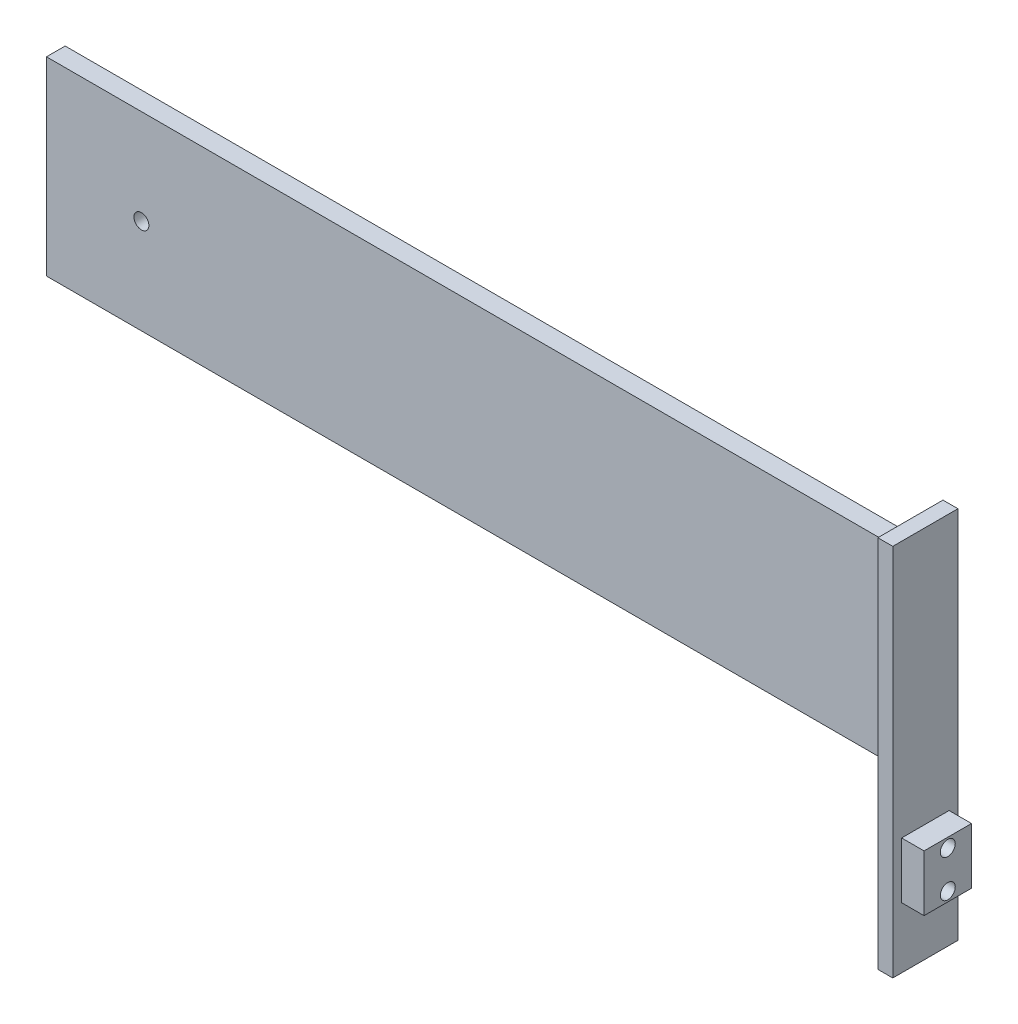
ISO-10303-21;
HEADER;
FILE_DESCRIPTION(('STEP AP214'),'2;1');
FILE_NAME('part.step','',(''),(''),'','','');
FILE_SCHEMA(('AUTOMOTIVE_DESIGN { 1 0 10303 214 1 1 1 1 }'));
ENDSEC;
DATA;
#1=APPLICATION_CONTEXT('core data for automotive mechanical design processes');
#2=APPLICATION_PROTOCOL_DEFINITION('international standard','automotive_design',2000,#1);
#3=PRODUCT_CONTEXT('',#1,'mechanical');
#4=PRODUCT('Part','Part','',(#3));
#5=PRODUCT_RELATED_PRODUCT_CATEGORY('part','',(#4));
#6=PRODUCT_DEFINITION_FORMATION('','',#4);
#7=PRODUCT_DEFINITION_CONTEXT('part definition',#1,'design');
#8=PRODUCT_DEFINITION('design','',#6,#7);
#9=PRODUCT_DEFINITION_SHAPE('','',#8);
#10=(LENGTH_UNIT() NAMED_UNIT(*) SI_UNIT(.MILLI.,.METRE.));
#11=(NAMED_UNIT(*) PLANE_ANGLE_UNIT() SI_UNIT($,.RADIAN.));
#12=(NAMED_UNIT(*) SI_UNIT($,.STERADIAN.) SOLID_ANGLE_UNIT());
#13=UNCERTAINTY_MEASURE_WITH_UNIT(LENGTH_MEASURE(1.E-05),#10,'distance_accuracy_value','');
#14=(GEOMETRIC_REPRESENTATION_CONTEXT(3) GLOBAL_UNCERTAINTY_ASSIGNED_CONTEXT((#13)) GLOBAL_UNIT_ASSIGNED_CONTEXT((#10,
#11,#12)) REPRESENTATION_CONTEXT('',''));
#15=CARTESIAN_POINT('',(0.,0.,0.));
#16=DIRECTION('',(0.,0.,1.));
#17=DIRECTION('',(1.,0.,0.));
#18=AXIS2_PLACEMENT_3D('',#15,#16,#17);
#19=CARTESIAN_POINT('',(-114.301,-49.840000088,2.49999999999999));
#20=DIRECTION('',(1.,0.,0.));
#21=DIRECTION('',(0.,0.,-1.));
#22=AXIS2_PLACEMENT_3D('',#19,#20,#21);
#23=CYLINDRICAL_SURFACE('',#22,2.);
#24=CARTESIAN_POINT('',(124.3,-49.840000088,2.49999999999999));
#25=DIRECTION('',(1.,0.,0.));
#26=DIRECTION('',(0.,0.,-1.));
#27=AXIS2_PLACEMENT_3D('',#24,#25,#26);
#28=CIRCLE('',#27,2.);
#29=CARTESIAN_POINT('',(124.3,-49.840000088,0.499999999999987));
#30=VERTEX_POINT('',#29);
#31=EDGE_CURVE('E270',#30,#30,#28,.T.);
#32=ORIENTED_EDGE('',*,*,#31,.T.);
#33=EDGE_LOOP('',(#32));
#34=FACE_BOUND('',#33,.T.);
#35=CARTESIAN_POINT('',(117.3,-49.840000088,2.49999999999999));
#36=DIRECTION('',(-1.,0.,0.));
#37=DIRECTION('',(0.,0.,1.));
#38=AXIS2_PLACEMENT_3D('',#35,#36,#37);
#39=CIRCLE('',#38,2.);
#40=CARTESIAN_POINT('',(117.3,-49.840000088,4.49999999999999));
#41=VERTEX_POINT('',#40);
#42=EDGE_CURVE('E265',#41,#41,#39,.F.);
#43=ORIENTED_EDGE('',*,*,#42,.F.);
#44=EDGE_LOOP('',(#43));
#45=FACE_BOUND('',#44,.T.);
#46=ADVANCED_FACE('F45',(#34,#45),#23,.F.);
#47=CARTESIAN_POINT('',(-114.301,-39.840000088,2.49999999999999));
#48=DIRECTION('',(1.,0.,0.));
#49=DIRECTION('',(0.,0.,-1.));
#50=AXIS2_PLACEMENT_3D('',#47,#48,#49);
#51=CYLINDRICAL_SURFACE('',#50,2.000000064);
#52=CARTESIAN_POINT('',(124.3,-39.840000088,2.49999999999999));
#53=DIRECTION('',(1.,0.,0.));
#54=DIRECTION('',(0.,0.,-1.));
#55=AXIS2_PLACEMENT_3D('',#52,#53,#54);
#56=CIRCLE('',#55,2.000000064);
#57=CARTESIAN_POINT('',(124.3,-39.840000088,0.499999935999988));
#58=VERTEX_POINT('',#57);
#59=EDGE_CURVE('E321',#58,#58,#56,.T.);
#60=ORIENTED_EDGE('',*,*,#59,.T.);
#61=EDGE_LOOP('',(#60));
#62=FACE_BOUND('',#61,.T.);
#63=CARTESIAN_POINT('',(117.3,-39.840000088,2.49999999999999));
#64=DIRECTION('',(-1.,0.,0.));
#65=DIRECTION('',(0.,0.,1.));
#66=AXIS2_PLACEMENT_3D('',#63,#64,#65);
#67=CIRCLE('',#66,2.000000064);
#68=CARTESIAN_POINT('',(117.3,-39.840000088,4.50000006399999));
#69=VERTEX_POINT('',#68);
#70=EDGE_CURVE('E261',#69,#69,#67,.F.);
#71=ORIENTED_EDGE('',*,*,#70,.F.);
#72=EDGE_LOOP('',(#71));
#73=FACE_BOUND('',#72,.T.);
#74=ADVANCED_FACE('F357',(#62,#73),#51,.F.);
#75=CARTESIAN_POINT('',(118.3,0.,0.));
#76=DIRECTION('',(1.,0.,0.));
#77=DIRECTION('',(0.,0.,-1.));
#78=AXIS2_PLACEMENT_3D('',#75,#76,#77);
#79=PLANE('',#78);
#80=DIRECTION('',(0.,1.,0.));
#81=VECTOR('',#80,1.);
#82=CARTESIAN_POINT('',(118.3,31.4,-6.21558258941596));
#83=LINE('',#82,#81);
#84=CARTESIAN_POINT('',(118.3,-68.6,-6.21558258941598));
#85=VERTEX_POINT('',#84);
#86=CARTESIAN_POINT('',(118.3,31.4,-6.21558258941596));
#87=VERTEX_POINT('',#86);
#88=EDGE_CURVE('E189',#85,#87,#83,.T.);
#89=ORIENTED_EDGE('',*,*,#88,.T.);
#90=DIRECTION('',(0.,0.,1.));
#91=VECTOR('',#90,1.);
#92=CARTESIAN_POINT('',(118.3,31.4,11.215582589416));
#93=LINE('',#92,#91);
#94=CARTESIAN_POINT('',(118.3,31.4,11.215582589416));
#95=VERTEX_POINT('',#94);
#96=EDGE_CURVE('E193',#87,#95,#93,.T.);
#97=ORIENTED_EDGE('',*,*,#96,.T.);
#98=DIRECTION('',(0.,-1.,0.));
#99=VECTOR('',#98,1.);
#100=CARTESIAN_POINT('',(118.3,31.4,11.215582589416));
#101=LINE('',#100,#99);
#102=CARTESIAN_POINT('',(118.3,-68.6,11.2155825894159));
#103=VERTEX_POINT('',#102);
#104=EDGE_CURVE('E197',#95,#103,#101,.T.);
#105=ORIENTED_EDGE('',*,*,#104,.T.);
#106=DIRECTION('',(0.,0.,-1.));
#107=VECTOR('',#106,1.);
#108=CARTESIAN_POINT('',(118.3,-68.6,11.2155825894159));
#109=LINE('',#108,#107);
#110=EDGE_CURVE('E200',#103,#85,#109,.T.);
#111=ORIENTED_EDGE('',*,*,#110,.T.);
#112=EDGE_LOOP('',(#89,#97,#105,#111));
#113=FACE_BOUND('',#112,.T.);
#114=DIRECTION('',(0.,0.,1.));
#115=VECTOR('',#114,1.);
#116=CARTESIAN_POINT('',(118.3,-37.340000008,8.84999999999999));
#117=LINE('',#116,#115);
#118=CARTESIAN_POINT('',(118.3,-37.340000008,-3.85000000000001));
#119=VERTEX_POINT('',#118);
#120=CARTESIAN_POINT('',(118.3,-37.340000008,8.84999999999999));
#121=VERTEX_POINT('',#120);
#122=EDGE_CURVE('E335',#119,#121,#117,.T.);
#123=ORIENTED_EDGE('',*,*,#122,.F.);
#124=DIRECTION('',(0.,1.,0.));
#125=VECTOR('',#124,1.);
#126=CARTESIAN_POINT('',(118.3,-37.340000008,-3.85000000000001));
#127=LINE('',#126,#125);
#128=CARTESIAN_POINT('',(118.3,-52.340000008,-3.85000000000001));
#129=VERTEX_POINT('',#128);
#130=EDGE_CURVE('E175',#129,#119,#127,.T.);
#131=ORIENTED_EDGE('',*,*,#130,.F.);
#132=DIRECTION('',(0.,0.,-1.));
#133=VECTOR('',#132,1.);
#134=CARTESIAN_POINT('',(118.3,-52.340000008,8.84999999999999));
#135=LINE('',#134,#133);
#136=CARTESIAN_POINT('',(118.3,-52.340000008,8.84999999999999));
#137=VERTEX_POINT('',#136);
#138=EDGE_CURVE('E171',#137,#129,#135,.T.);
#139=ORIENTED_EDGE('',*,*,#138,.F.);
#140=DIRECTION('',(0.,-1.,0.));
#141=VECTOR('',#140,1.);
#142=CARTESIAN_POINT('',(118.3,-37.340000008,8.84999999999999));
#143=LINE('',#142,#141);
#144=EDGE_CURVE('E338',#121,#137,#143,.T.);
#145=ORIENTED_EDGE('',*,*,#144,.F.);
#146=EDGE_LOOP('',(#123,#131,#139,#145));
#147=FACE_BOUND('',#146,.T.);
#148=ADVANCED_FACE('F354',(#113,#147),#79,.T.);
#149=CARTESIAN_POINT('',(-114.3,25.4,5.));
#150=DIRECTION('',(0.,-1.,0.));
#151=DIRECTION('',(0.,0.,-1.));
#152=AXIS2_PLACEMENT_3D('',#149,#150,#151);
#153=PLANE('',#152);
#154=DIRECTION('',(-1.,0.,0.));
#155=VECTOR('',#154,1.);
#156=CARTESIAN_POINT('',(-114.3,25.4,5.));
#157=LINE('',#156,#155);
#158=CARTESIAN_POINT('',(111.76,25.4,5.));
#159=VERTEX_POINT('',#158);
#160=CARTESIAN_POINT('',(-114.3,25.4,5.));
#161=VERTEX_POINT('',#160);
#162=EDGE_CURVE('E235',#159,#161,#157,.T.);
#163=ORIENTED_EDGE('',*,*,#162,.F.);
#164=DIRECTION('',(0.,0.,-1.));
#165=VECTOR('',#164,1.);
#166=CARTESIAN_POINT('',(111.76,25.4,0.));
#167=LINE('',#166,#165);
#168=CARTESIAN_POINT('',(111.76,25.4,0.));
#169=VERTEX_POINT('',#168);
#170=EDGE_CURVE('E260',#159,#169,#167,.T.);
#171=ORIENTED_EDGE('',*,*,#170,.T.);
#172=DIRECTION('',(-1.,0.,0.));
#173=VECTOR('',#172,1.);
#174=CARTESIAN_POINT('',(-114.3,25.4,0.));
#175=LINE('',#174,#173);
#176=CARTESIAN_POINT('',(-114.3,25.4,0.));
#177=VERTEX_POINT('',#176);
#178=EDGE_CURVE('E231',#169,#177,#175,.T.);
#179=ORIENTED_EDGE('',*,*,#178,.T.);
#180=DIRECTION('',(0.,0.,-1.));
#181=VECTOR('',#180,1.);
#182=CARTESIAN_POINT('',(-114.3,25.4,5.));
#183=LINE('',#182,#181);
#184=EDGE_CURVE('E256',#161,#177,#183,.T.);
#185=ORIENTED_EDGE('',*,*,#184,.F.);
#186=EDGE_LOOP('',(#163,#171,#179,#185));
#187=FACE_BOUND('',#186,.T.);
#188=ADVANCED_FACE('F356',(#187),#153,.F.);
#189=CARTESIAN_POINT('',(-114.3,25.4,5.));
#190=DIRECTION('',(1.,0.,0.));
#191=DIRECTION('',(0.,0.,-1.));
#192=AXIS2_PLACEMENT_3D('',#189,#190,#191);
#193=PLANE('',#192);
#194=DIRECTION('',(0.,-1.,0.));
#195=VECTOR('',#194,1.);
#196=CARTESIAN_POINT('',(-114.3,25.4,0.));
#197=LINE('',#196,#195);
#198=CARTESIAN_POINT('',(-114.3,-25.4,0.));
#199=VERTEX_POINT('',#198);
#200=EDGE_CURVE('E248',#177,#199,#197,.T.);
#201=ORIENTED_EDGE('',*,*,#200,.T.);
#202=DIRECTION('',(0.,0.,-1.));
#203=VECTOR('',#202,1.);
#204=CARTESIAN_POINT('',(-114.3,-25.4,5.));
#205=LINE('',#204,#203);
#206=CARTESIAN_POINT('',(-114.3,-25.4,5.));
#207=VERTEX_POINT('',#206);
#208=EDGE_CURVE('E245',#207,#199,#205,.T.);
#209=ORIENTED_EDGE('',*,*,#208,.F.);
#210=DIRECTION('',(0.,-1.,0.));
#211=VECTOR('',#210,1.);
#212=CARTESIAN_POINT('',(-114.3,25.4,5.));
#213=LINE('',#212,#211);
#214=EDGE_CURVE('E238',#161,#207,#213,.T.);
#215=ORIENTED_EDGE('',*,*,#214,.F.);
#216=ORIENTED_EDGE('',*,*,#184,.T.);
#217=EDGE_LOOP('',(#201,#209,#215,#216));
#218=FACE_BOUND('',#217,.T.);
#219=ADVANCED_FACE('F365',(#218),#193,.F.);
#220=CARTESIAN_POINT('',(-114.3,-25.4,5.));
#221=DIRECTION('',(0.,1.,0.));
#222=DIRECTION('',(0.,0.,1.));
#223=AXIS2_PLACEMENT_3D('',#220,#221,#222);
#224=PLANE('',#223);
#225=DIRECTION('',(1.,0.,0.));
#226=VECTOR('',#225,1.);
#227=CARTESIAN_POINT('',(-114.3,-25.4,0.));
#228=LINE('',#227,#226);
#229=CARTESIAN_POINT('',(111.76,-25.4,0.));
#230=VERTEX_POINT('',#229);
#231=EDGE_CURVE('E239',#199,#230,#228,.T.);
#232=ORIENTED_EDGE('',*,*,#231,.T.);
#233=DIRECTION('',(0.,0.,-1.));
#234=VECTOR('',#233,1.);
#235=CARTESIAN_POINT('',(111.76,-25.4,5.));
#236=LINE('',#235,#234);
#237=CARTESIAN_POINT('',(111.76,-25.4,5.));
#238=VERTEX_POINT('',#237);
#239=EDGE_CURVE('E55',#230,#238,#236,.F.);
#240=ORIENTED_EDGE('',*,*,#239,.T.);
#241=DIRECTION('',(1.,0.,0.));
#242=VECTOR('',#241,1.);
#243=CARTESIAN_POINT('',(-114.3,-25.4,5.));
#244=LINE('',#243,#242);
#245=EDGE_CURVE('E242',#207,#238,#244,.T.);
#246=ORIENTED_EDGE('',*,*,#245,.F.);
#247=ORIENTED_EDGE('',*,*,#208,.T.);
#248=EDGE_LOOP('',(#232,#240,#246,#247));
#249=FACE_BOUND('',#248,.T.);
#250=ADVANCED_FACE('F419',(#249),#224,.F.);
#251=CARTESIAN_POINT('',(0.,0.,5.));
#252=DIRECTION('',(0.,0.,1.));
#253=DIRECTION('',(1.,0.,0.));
#254=AXIS2_PLACEMENT_3D('',#251,#252,#253);
#255=PLANE('',#254);
#256=CARTESIAN_POINT('',(-88.9000000000001,0.,5.));
#257=DIRECTION('',(0.,0.,1.));
#258=DIRECTION('',(1.,0.,0.));
#259=AXIS2_PLACEMENT_3D('',#256,#257,#258);
#260=CIRCLE('',#259,2.00000006400001);
#261=CARTESIAN_POINT('',(-86.8999999360001,0.,5.));
#262=VERTEX_POINT('',#261);
#263=EDGE_CURVE('E226',#262,#262,#260,.T.);
#264=ORIENTED_EDGE('',*,*,#263,.F.);
#265=EDGE_LOOP('',(#264));
#266=FACE_BOUND('',#265,.T.);
#267=ORIENTED_EDGE('',*,*,#245,.T.);
#268=DIRECTION('',(0.,1.,0.));
#269=VECTOR('',#268,1.);
#270=CARTESIAN_POINT('',(111.76,0.,5.));
#271=LINE('',#270,#269);
#272=EDGE_CURVE('E11',#238,#159,#271,.T.);
#273=ORIENTED_EDGE('',*,*,#272,.T.);
#274=ORIENTED_EDGE('',*,*,#162,.T.);
#275=ORIENTED_EDGE('',*,*,#214,.T.);
#276=EDGE_LOOP('',(#267,#273,#274,#275));
#277=FACE_BOUND('',#276,.T.);
#278=ADVANCED_FACE('F416',(#266,#277),#255,.T.);
#279=CARTESIAN_POINT('',(0.,0.,0.));
#280=DIRECTION('',(0.,0.,1.));
#281=DIRECTION('',(1.,0.,0.));
#282=AXIS2_PLACEMENT_3D('',#279,#280,#281);
#283=PLANE('',#282);
#284=CARTESIAN_POINT('',(-88.9000000000001,0.,0.));
#285=DIRECTION('',(0.,0.,1.));
#286=DIRECTION('',(1.,0.,0.));
#287=AXIS2_PLACEMENT_3D('',#284,#285,#286);
#288=CIRCLE('',#287,2.00000006400001);
#289=CARTESIAN_POINT('',(-86.8999999360001,0.,0.));
#290=VERTEX_POINT('',#289);
#291=EDGE_CURVE('E227',#290,#290,#288,.T.);
#292=ORIENTED_EDGE('',*,*,#291,.T.);
#293=EDGE_LOOP('',(#292));
#294=FACE_BOUND('',#293,.T.);
#295=ORIENTED_EDGE('',*,*,#178,.F.);
#296=DIRECTION('',(0.,1.,0.));
#297=VECTOR('',#296,1.);
#298=CARTESIAN_POINT('',(111.76,-25.4,0.));
#299=LINE('',#298,#297);
#300=EDGE_CURVE('E70',#169,#230,#299,.F.);
#301=ORIENTED_EDGE('',*,*,#300,.T.);
#302=ORIENTED_EDGE('',*,*,#231,.F.);
#303=ORIENTED_EDGE('',*,*,#200,.F.);
#304=EDGE_LOOP('',(#295,#301,#302,#303));
#305=FACE_BOUND('',#304,.T.);
#306=ADVANCED_FACE('F414',(#294,#305),#283,.F.);
#307=CARTESIAN_POINT('',(-88.9000000000001,0.,0.));
#308=DIRECTION('',(0.,0.,1.));
#309=DIRECTION('',(1.,0.,0.));
#310=AXIS2_PLACEMENT_3D('',#307,#308,#309);
#311=CYLINDRICAL_SURFACE('',#310,2.00000006400001);
#312=ORIENTED_EDGE('',*,*,#291,.F.);
#313=EDGE_LOOP('',(#312));
#314=FACE_BOUND('',#313,.T.);
#315=ORIENTED_EDGE('',*,*,#263,.T.);
#316=EDGE_LOOP('',(#315));
#317=FACE_BOUND('',#316,.T.);
#318=ADVANCED_FACE('F411',(#314,#317),#311,.F.);
#319=CARTESIAN_POINT('',(114.3,0.,0.));
#320=DIRECTION('',(1.,0.,0.));
#321=DIRECTION('',(0.,0.,-1.));
#322=AXIS2_PLACEMENT_3D('',#319,#320,#321);
#323=PLANE('',#322);
#324=DIRECTION('',(0.,1.,0.));
#325=VECTOR('',#324,1.);
#326=CARTESIAN_POINT('',(114.3,25.4,-2.54));
#327=LINE('',#326,#325);
#328=CARTESIAN_POINT('',(114.3,-27.94,-2.54));
#329=VERTEX_POINT('',#328);
#330=CARTESIAN_POINT('',(114.3,27.94,-2.54));
#331=VERTEX_POINT('',#330);
#332=EDGE_CURVE('E280',#329,#331,#327,.T.);
#333=ORIENTED_EDGE('',*,*,#332,.T.);
#334=DIRECTION('',(0.,0.,-1.));
#335=VECTOR('',#334,1.);
#336=CARTESIAN_POINT('',(114.3,27.94,5.));
#337=LINE('',#336,#335);
#338=CARTESIAN_POINT('',(114.3,27.94,7.54));
#339=VERTEX_POINT('',#338);
#340=EDGE_CURVE('E283',#331,#339,#337,.F.);
#341=ORIENTED_EDGE('',*,*,#340,.T.);
#342=DIRECTION('',(0.,1.,0.));
#343=VECTOR('',#342,1.);
#344=CARTESIAN_POINT('',(114.3,0.,7.54));
#345=LINE('',#344,#343);
#346=CARTESIAN_POINT('',(114.3,-27.94,7.54));
#347=VERTEX_POINT('',#346);
#348=EDGE_CURVE('E274',#339,#347,#345,.F.);
#349=ORIENTED_EDGE('',*,*,#348,.T.);
#350=DIRECTION('',(0.,0.,-1.));
#351=VECTOR('',#350,1.);
#352=CARTESIAN_POINT('',(114.3,-27.94,0.));
#353=LINE('',#352,#351);
#354=EDGE_CURVE('E277',#347,#329,#353,.T.);
#355=ORIENTED_EDGE('',*,*,#354,.T.);
#356=EDGE_LOOP('',(#333,#341,#349,#355));
#357=FACE_BOUND('',#356,.T.);
#358=CARTESIAN_POINT('',(114.3,-39.840000088,2.49999999999999));
#359=DIRECTION('',(-1.,0.,0.));
#360=DIRECTION('',(0.,0.,1.));
#361=AXIS2_PLACEMENT_3D('',#358,#359,#360);
#362=CIRCLE('',#361,3.5);
#363=CARTESIAN_POINT('',(114.3,-39.840000088,5.99999999999999));
#364=VERTEX_POINT('',#363);
#365=EDGE_CURVE('E317',#364,#364,#362,.T.);
#366=ORIENTED_EDGE('',*,*,#365,.F.);
#367=EDGE_LOOP('',(#366));
#368=FACE_BOUND('',#367,.T.);
#369=CARTESIAN_POINT('',(114.3,-49.840000088,2.49999999999999));
#370=DIRECTION('',(-1.,0.,0.));
#371=DIRECTION('',(0.,0.,1.));
#372=AXIS2_PLACEMENT_3D('',#369,#370,#371);
#373=CIRCLE('',#372,3.5);
#374=CARTESIAN_POINT('',(114.3,-49.840000088,5.99999999999999));
#375=VERTEX_POINT('',#374);
#376=EDGE_CURVE('E311',#375,#375,#373,.T.);
#377=ORIENTED_EDGE('',*,*,#376,.F.);
#378=EDGE_LOOP('',(#377));
#379=FACE_BOUND('',#378,.T.);
#380=DIRECTION('',(0.,1.,0.));
#381=VECTOR('',#380,1.);
#382=CARTESIAN_POINT('',(114.3,31.4,-6.21558258941596));
#383=LINE('',#382,#381);
#384=CARTESIAN_POINT('',(114.3,-68.6,-6.21558258941598));
#385=VERTEX_POINT('',#384);
#386=CARTESIAN_POINT('',(114.3,31.4,-6.21558258941596));
#387=VERTEX_POINT('',#386);
#388=EDGE_CURVE('E178',#385,#387,#383,.T.);
#389=ORIENTED_EDGE('',*,*,#388,.F.);
#390=DIRECTION('',(0.,0.,-1.));
#391=VECTOR('',#390,1.);
#392=CARTESIAN_POINT('',(114.3,-68.6,11.2155825894159));
#393=LINE('',#392,#391);
#394=CARTESIAN_POINT('',(114.3,-68.6,11.2155825894159));
#395=VERTEX_POINT('',#394);
#396=EDGE_CURVE('E194',#395,#385,#393,.T.);
#397=ORIENTED_EDGE('',*,*,#396,.F.);
#398=DIRECTION('',(0.,-1.,0.));
#399=VECTOR('',#398,1.);
#400=CARTESIAN_POINT('',(114.3,31.4,11.215582589416));
#401=LINE('',#400,#399);
#402=CARTESIAN_POINT('',(114.3,31.4,11.215582589416));
#403=VERTEX_POINT('',#402);
#404=EDGE_CURVE('E206',#403,#395,#401,.T.);
#405=ORIENTED_EDGE('',*,*,#404,.F.);
#406=DIRECTION('',(0.,0.,1.));
#407=VECTOR('',#406,1.);
#408=CARTESIAN_POINT('',(114.3,31.4,11.215582589416));
#409=LINE('',#408,#407);
#410=EDGE_CURVE('E183',#387,#403,#409,.T.);
#411=ORIENTED_EDGE('',*,*,#410,.F.);
#412=EDGE_LOOP('',(#389,#397,#405,#411));
#413=FACE_BOUND('',#412,.T.);
#414=ADVANCED_FACE('F402',(#357,#368,#379,#413),#323,.F.);
#415=CARTESIAN_POINT('',(118.3,31.4,-6.21558258941596));
#416=DIRECTION('',(0.,0.,1.));
#417=DIRECTION('',(0.,-1.,0.));
#418=AXIS2_PLACEMENT_3D('',#415,#416,#417);
#419=PLANE('',#418);
#420=ORIENTED_EDGE('',*,*,#388,.T.);
#421=DIRECTION('',(-1.,0.,0.));
#422=VECTOR('',#421,1.);
#423=CARTESIAN_POINT('',(118.3,31.4,-6.21558258941596));
#424=LINE('',#423,#422);
#425=EDGE_CURVE('E222',#87,#387,#424,.T.);
#426=ORIENTED_EDGE('',*,*,#425,.F.);
#427=ORIENTED_EDGE('',*,*,#88,.F.);
#428=DIRECTION('',(-1.,0.,0.));
#429=VECTOR('',#428,1.);
#430=CARTESIAN_POINT('',(118.3,-68.6,-6.21558258941598));
#431=LINE('',#430,#429);
#432=EDGE_CURVE('E202',#85,#385,#431,.T.);
#433=ORIENTED_EDGE('',*,*,#432,.T.);
#434=EDGE_LOOP('',(#420,#426,#427,#433));
#435=FACE_BOUND('',#434,.T.);
#436=ADVANCED_FACE('F406',(#435),#419,.F.);
#437=CARTESIAN_POINT('',(118.3,31.4,11.215582589416));
#438=DIRECTION('',(0.,-1.,0.));
#439=DIRECTION('',(0.,0.,-1.));
#440=AXIS2_PLACEMENT_3D('',#437,#438,#439);
#441=PLANE('',#440);
#442=ORIENTED_EDGE('',*,*,#410,.T.);
#443=DIRECTION('',(-1.,0.,0.));
#444=VECTOR('',#443,1.);
#445=CARTESIAN_POINT('',(118.3,31.4,11.215582589416));
#446=LINE('',#445,#444);
#447=EDGE_CURVE('E218',#95,#403,#446,.T.);
#448=ORIENTED_EDGE('',*,*,#447,.F.);
#449=ORIENTED_EDGE('',*,*,#96,.F.);
#450=ORIENTED_EDGE('',*,*,#425,.T.);
#451=EDGE_LOOP('',(#442,#448,#449,#450));
#452=FACE_BOUND('',#451,.T.);
#453=ADVANCED_FACE('F399',(#452),#441,.F.);
#454=CARTESIAN_POINT('',(118.3,31.4,11.215582589416));
#455=DIRECTION('',(0.,0.,-1.));
#456=DIRECTION('',(0.,1.,0.));
#457=AXIS2_PLACEMENT_3D('',#454,#455,#456);
#458=PLANE('',#457);
#459=ORIENTED_EDGE('',*,*,#404,.T.);
#460=DIRECTION('',(-1.,0.,0.));
#461=VECTOR('',#460,1.);
#462=CARTESIAN_POINT('',(118.3,-68.6,11.2155825894159));
#463=LINE('',#462,#461);
#464=EDGE_CURVE('E214',#103,#395,#463,.T.);
#465=ORIENTED_EDGE('',*,*,#464,.F.);
#466=ORIENTED_EDGE('',*,*,#104,.F.);
#467=ORIENTED_EDGE('',*,*,#447,.T.);
#468=EDGE_LOOP('',(#459,#465,#466,#467));
#469=FACE_BOUND('',#468,.T.);
#470=ADVANCED_FACE('F393',(#469),#458,.F.);
#471=CARTESIAN_POINT('',(118.3,-68.6,11.2155825894159));
#472=DIRECTION('',(0.,1.,0.));
#473=DIRECTION('',(0.,0.,1.));
#474=AXIS2_PLACEMENT_3D('',#471,#472,#473);
#475=PLANE('',#474);
#476=ORIENTED_EDGE('',*,*,#396,.T.);
#477=ORIENTED_EDGE('',*,*,#432,.F.);
#478=ORIENTED_EDGE('',*,*,#110,.F.);
#479=ORIENTED_EDGE('',*,*,#464,.T.);
#480=EDGE_LOOP('',(#476,#477,#478,#479));
#481=FACE_BOUND('',#480,.T.);
#482=ADVANCED_FACE('F390',(#481),#475,.F.);
#483=CARTESIAN_POINT('',(124.3,-37.340000008,-3.85000000000001));
#484=DIRECTION('',(0.,0.,1.));
#485=DIRECTION('',(0.,-1.,0.));
#486=AXIS2_PLACEMENT_3D('',#483,#484,#485);
#487=PLANE('',#486);
#488=ORIENTED_EDGE('',*,*,#130,.T.);
#489=DIRECTION('',(-1.,0.,0.));
#490=VECTOR('',#489,1.);
#491=CARTESIAN_POINT('',(124.3,-37.340000008,-3.85000000000001));
#492=LINE('',#491,#490);
#493=CARTESIAN_POINT('',(124.3,-37.340000008,-3.85000000000001));
#494=VERTEX_POINT('',#493);
#495=EDGE_CURVE('E153',#494,#119,#492,.T.);
#496=ORIENTED_EDGE('',*,*,#495,.F.);
#497=DIRECTION('',(0.,1.,0.));
#498=VECTOR('',#497,1.);
#499=CARTESIAN_POINT('',(124.3,-37.340000008,-3.85000000000001));
#500=LINE('',#499,#498);
#501=CARTESIAN_POINT('',(124.3,-52.340000008,-3.85000000000001));
#502=VERTEX_POINT('',#501);
#503=EDGE_CURVE('E161',#502,#494,#500,.T.);
#504=ORIENTED_EDGE('',*,*,#503,.F.);
#505=DIRECTION('',(-1.,0.,0.));
#506=VECTOR('',#505,1.);
#507=CARTESIAN_POINT('',(124.3,-52.340000008,-3.85000000000001));
#508=LINE('',#507,#506);
#509=EDGE_CURVE('E332',#502,#129,#508,.T.);
#510=ORIENTED_EDGE('',*,*,#509,.T.);
#511=EDGE_LOOP('',(#488,#496,#504,#510));
#512=FACE_BOUND('',#511,.T.);
#513=ADVANCED_FACE('F173',(#512),#487,.F.);
#514=CARTESIAN_POINT('',(124.3,-37.340000008,8.84999999999999));
#515=DIRECTION('',(0.,-1.,0.));
#516=DIRECTION('',(0.,0.,-1.));
#517=AXIS2_PLACEMENT_3D('',#514,#515,#516);
#518=PLANE('',#517);
#519=ORIENTED_EDGE('',*,*,#122,.T.);
#520=DIRECTION('',(-1.,0.,0.));
#521=VECTOR('',#520,1.);
#522=CARTESIAN_POINT('',(124.3,-37.340000008,8.84999999999999));
#523=LINE('',#522,#521);
#524=CARTESIAN_POINT('',(124.3,-37.340000008,8.84999999999999));
#525=VERTEX_POINT('',#524);
#526=EDGE_CURVE('E156',#525,#121,#523,.T.);
#527=ORIENTED_EDGE('',*,*,#526,.F.);
#528=DIRECTION('',(0.,0.,1.));
#529=VECTOR('',#528,1.);
#530=CARTESIAN_POINT('',(124.3,-37.340000008,8.84999999999999));
#531=LINE('',#530,#529);
#532=EDGE_CURVE('E149',#494,#525,#531,.T.);
#533=ORIENTED_EDGE('',*,*,#532,.F.);
#534=ORIENTED_EDGE('',*,*,#495,.T.);
#535=EDGE_LOOP('',(#519,#527,#533,#534));
#536=FACE_BOUND('',#535,.T.);
#537=ADVANCED_FACE('F151',(#536),#518,.F.);
#538=CARTESIAN_POINT('',(124.3,-37.340000008,8.84999999999999));
#539=DIRECTION('',(0.,0.,-1.));
#540=DIRECTION('',(0.,1.,0.));
#541=AXIS2_PLACEMENT_3D('',#538,#539,#540);
#542=PLANE('',#541);
#543=ORIENTED_EDGE('',*,*,#144,.T.);
#544=DIRECTION('',(-1.,0.,0.));
#545=VECTOR('',#544,1.);
#546=CARTESIAN_POINT('',(124.3,-52.340000008,8.84999999999999));
#547=LINE('',#546,#545);
#548=CARTESIAN_POINT('',(124.3,-52.340000008,8.84999999999999));
#549=VERTEX_POINT('',#548);
#550=EDGE_CURVE('E185',#549,#137,#547,.T.);
#551=ORIENTED_EDGE('',*,*,#550,.F.);
#552=DIRECTION('',(0.,-1.,0.));
#553=VECTOR('',#552,1.);
#554=CARTESIAN_POINT('',(124.3,-37.340000008,8.84999999999999));
#555=LINE('',#554,#553);
#556=EDGE_CURVE('E160',#525,#549,#555,.T.);
#557=ORIENTED_EDGE('',*,*,#556,.F.);
#558=ORIENTED_EDGE('',*,*,#526,.T.);
#559=EDGE_LOOP('',(#543,#551,#557,#558));
#560=FACE_BOUND('',#559,.T.);
#561=ADVANCED_FACE('F352',(#560),#542,.F.);
#562=CARTESIAN_POINT('',(124.3,-52.340000008,8.84999999999999));
#563=DIRECTION('',(0.,1.,0.));
#564=DIRECTION('',(0.,0.,1.));
#565=AXIS2_PLACEMENT_3D('',#562,#563,#564);
#566=PLANE('',#565);
#567=ORIENTED_EDGE('',*,*,#138,.T.);
#568=ORIENTED_EDGE('',*,*,#509,.F.);
#569=DIRECTION('',(0.,0.,-1.));
#570=VECTOR('',#569,1.);
#571=CARTESIAN_POINT('',(124.3,-52.340000008,8.84999999999999));
#572=LINE('',#571,#570);
#573=EDGE_CURVE('E166',#549,#502,#572,.T.);
#574=ORIENTED_EDGE('',*,*,#573,.F.);
#575=ORIENTED_EDGE('',*,*,#550,.T.);
#576=EDGE_LOOP('',(#567,#568,#574,#575));
#577=FACE_BOUND('',#576,.T.);
#578=ADVANCED_FACE('F348',(#577),#566,.F.);
#579=CARTESIAN_POINT('',(124.3,0.,0.));
#580=DIRECTION('',(1.,0.,0.));
#581=DIRECTION('',(0.,0.,-1.));
#582=AXIS2_PLACEMENT_3D('',#579,#580,#581);
#583=PLANE('',#582);
#584=ORIENTED_EDGE('',*,*,#59,.F.);
#585=EDGE_LOOP('',(#584));
#586=FACE_BOUND('',#585,.T.);
#587=ORIENTED_EDGE('',*,*,#31,.F.);
#588=EDGE_LOOP('',(#587));
#589=FACE_BOUND('',#588,.T.);
#590=ORIENTED_EDGE('',*,*,#503,.T.);
#591=ORIENTED_EDGE('',*,*,#532,.T.);
#592=ORIENTED_EDGE('',*,*,#556,.T.);
#593=ORIENTED_EDGE('',*,*,#573,.T.);
#594=EDGE_LOOP('',(#590,#591,#592,#593));
#595=FACE_BOUND('',#594,.T.);
#596=ADVANCED_FACE('F164',(#586,#589,#595),#583,.T.);
#597=CARTESIAN_POINT('',(117.3,-39.840000088,2.49999999999999));
#598=DIRECTION('',(-1.,0.,0.));
#599=DIRECTION('',(0.,0.,1.));
#600=AXIS2_PLACEMENT_3D('',#597,#598,#599);
#601=PLANE('',#600);
#602=CARTESIAN_POINT('',(117.3,-39.840000088,2.49999999999999));
#603=DIRECTION('',(-1.,0.,0.));
#604=DIRECTION('',(0.,0.,1.));
#605=AXIS2_PLACEMENT_3D('',#602,#603,#604);
#606=CIRCLE('',#605,3.5);
#607=CARTESIAN_POINT('',(117.3,-39.840000088,5.99999999999999));
#608=VERTEX_POINT('',#607);
#609=EDGE_CURVE('E266',#608,#608,#606,.T.);
#610=ORIENTED_EDGE('',*,*,#609,.T.);
#611=EDGE_LOOP('',(#610));
#612=FACE_BOUND('',#611,.T.);
#613=ORIENTED_EDGE('',*,*,#70,.T.);
#614=EDGE_LOOP('',(#613));
#615=FACE_BOUND('',#614,.T.);
#616=ADVANCED_FACE('F383',(#612,#615),#601,.T.);
#617=CARTESIAN_POINT('',(117.3,-39.840000088,2.49999999999999));
#618=DIRECTION('',(-1.,0.,0.));
#619=DIRECTION('',(0.,0.,1.));
#620=AXIS2_PLACEMENT_3D('',#617,#618,#619);
#621=CYLINDRICAL_SURFACE('',#620,3.5);
#622=ORIENTED_EDGE('',*,*,#609,.F.);
#623=EDGE_LOOP('',(#622));
#624=FACE_BOUND('',#623,.T.);
#625=ORIENTED_EDGE('',*,*,#365,.T.);
#626=EDGE_LOOP('',(#625));
#627=FACE_BOUND('',#626,.T.);
#628=ADVANCED_FACE('F487',(#624,#627),#621,.F.);
#629=CARTESIAN_POINT('',(117.3,-49.840000088,2.49999999999999));
#630=DIRECTION('',(-1.,0.,0.));
#631=DIRECTION('',(0.,0.,1.));
#632=AXIS2_PLACEMENT_3D('',#629,#630,#631);
#633=PLANE('',#632);
#634=CARTESIAN_POINT('',(117.3,-49.840000088,2.49999999999999));
#635=DIRECTION('',(-1.,0.,0.));
#636=DIRECTION('',(0.,0.,1.));
#637=AXIS2_PLACEMENT_3D('',#634,#635,#636);
#638=CIRCLE('',#637,3.5);
#639=CARTESIAN_POINT('',(117.3,-49.840000088,5.99999999999999));
#640=VERTEX_POINT('',#639);
#641=EDGE_CURVE('E304',#640,#640,#638,.T.);
#642=ORIENTED_EDGE('',*,*,#641,.T.);
#643=EDGE_LOOP('',(#642));
#644=FACE_BOUND('',#643,.T.);
#645=ORIENTED_EDGE('',*,*,#42,.T.);
#646=EDGE_LOOP('',(#645));
#647=FACE_BOUND('',#646,.T.);
#648=ADVANCED_FACE('F446',(#644,#647),#633,.T.);
#649=CARTESIAN_POINT('',(117.3,-49.840000088,2.49999999999999));
#650=DIRECTION('',(-1.,0.,0.));
#651=DIRECTION('',(0.,0.,1.));
#652=AXIS2_PLACEMENT_3D('',#649,#650,#651);
#653=CYLINDRICAL_SURFACE('',#652,3.5);
#654=ORIENTED_EDGE('',*,*,#641,.F.);
#655=EDGE_LOOP('',(#654));
#656=FACE_BOUND('',#655,.T.);
#657=ORIENTED_EDGE('',*,*,#376,.T.);
#658=EDGE_LOOP('',(#657));
#659=FACE_BOUND('',#658,.T.);
#660=ADVANCED_FACE('F440',(#656,#659),#653,.F.);
#661=CARTESIAN_POINT('',(111.76,-27.94,0.));
#662=DIRECTION('',(0.,0.,1.));
#663=DIRECTION('',(1.,0.,0.));
#664=AXIS2_PLACEMENT_3D('',#661,#662,#663);
#665=CYLINDRICAL_SURFACE('',#664,2.54);
#666=CARTESIAN_POINT('',(111.76,-27.94,-2.54));
#667=DIRECTION('',(0.,-0.707106781186547,0.707106781186547));
#668=DIRECTION('',(0.,0.707106781186547,0.707106781186547));
#669=AXIS2_PLACEMENT_3D('',#666,#667,#668);
#670=ELLIPSE('',#669,3.59210244842766,2.54);
#671=EDGE_CURVE('E296',#329,#230,#670,.T.);
#672=ORIENTED_EDGE('',*,*,#671,.F.);
#673=ORIENTED_EDGE('',*,*,#354,.F.);
#674=CARTESIAN_POINT('',(111.76,-27.94,7.54));
#675=DIRECTION('',(0.,0.707106781186547,0.707106781186547));
#676=DIRECTION('',(0.,0.707106781186547,-0.707106781186547));
#677=AXIS2_PLACEMENT_3D('',#674,#675,#676);
#678=ELLIPSE('',#677,3.59210244842766,2.54);
#679=EDGE_CURVE('E49',#238,#347,#678,.F.);
#680=ORIENTED_EDGE('',*,*,#679,.F.);
#681=ORIENTED_EDGE('',*,*,#239,.F.);
#682=EDGE_LOOP('',(#672,#673,#680,#681));
#683=FACE_BOUND('',#682,.T.);
#684=ADVANCED_FACE('F47',(#683),#665,.F.);
#685=CARTESIAN_POINT('',(111.76,0.,7.54));
#686=DIRECTION('',(0.,1.,0.));
#687=DIRECTION('',(0.,0.,1.));
#688=AXIS2_PLACEMENT_3D('',#685,#686,#687);
#689=CYLINDRICAL_SURFACE('',#688,2.54);
#690=ORIENTED_EDGE('',*,*,#679,.T.);
#691=ORIENTED_EDGE('',*,*,#348,.F.);
#692=CARTESIAN_POINT('',(111.76,27.94,7.54));
#693=DIRECTION('',(0.,0.707106781186547,-0.707106781186547));
#694=DIRECTION('',(0.,0.707106781186547,0.707106781186547));
#695=AXIS2_PLACEMENT_3D('',#692,#693,#694);
#696=ELLIPSE('',#695,3.59210244842766,2.54);
#697=EDGE_CURVE('E294',#159,#339,#696,.F.);
#698=ORIENTED_EDGE('',*,*,#697,.F.);
#699=ORIENTED_EDGE('',*,*,#272,.F.);
#700=EDGE_LOOP('',(#690,#691,#698,#699));
#701=FACE_BOUND('',#700,.T.);
#702=ADVANCED_FACE('F435',(#701),#689,.F.);
#703=CARTESIAN_POINT('',(111.76,0.,-2.54));
#704=DIRECTION('',(0.,-1.,0.));
#705=DIRECTION('',(0.,0.,-1.));
#706=AXIS2_PLACEMENT_3D('',#703,#704,#705);
#707=CYLINDRICAL_SURFACE('',#706,2.54);
#708=ORIENTED_EDGE('',*,*,#671,.T.);
#709=ORIENTED_EDGE('',*,*,#300,.F.);
#710=CARTESIAN_POINT('',(111.76,27.94,-2.54));
#711=DIRECTION('',(0.,-0.707106781186547,-0.707106781186547));
#712=DIRECTION('',(0.,-0.707106781186547,0.707106781186547));
#713=AXIS2_PLACEMENT_3D('',#710,#711,#712);
#714=ELLIPSE('',#713,3.59210244842766,2.54);
#715=EDGE_CURVE('E291',#331,#169,#714,.T.);
#716=ORIENTED_EDGE('',*,*,#715,.F.);
#717=ORIENTED_EDGE('',*,*,#332,.F.);
#718=EDGE_LOOP('',(#708,#709,#716,#717));
#719=FACE_BOUND('',#718,.T.);
#720=ADVANCED_FACE('F432',(#719),#707,.F.);
#721=CARTESIAN_POINT('',(111.76,27.94,5.));
#722=DIRECTION('',(0.,0.,1.));
#723=DIRECTION('',(1.,0.,0.));
#724=AXIS2_PLACEMENT_3D('',#721,#722,#723);
#725=CYLINDRICAL_SURFACE('',#724,2.54);
#726=ORIENTED_EDGE('',*,*,#697,.T.);
#727=ORIENTED_EDGE('',*,*,#340,.F.);
#728=ORIENTED_EDGE('',*,*,#715,.T.);
#729=ORIENTED_EDGE('',*,*,#170,.F.);
#730=EDGE_LOOP('',(#726,#727,#728,#729));
#731=FACE_BOUND('',#730,.T.);
#732=ADVANCED_FACE('F429',(#731),#725,.F.);
#733=CLOSED_SHELL('',(#46,#74,#148,#188,#219,#250,#278,#306,#318,#414,#436,#453,#470,#482,#513,
#537,#561,#578,#596,#616,#628,#648,#660,#684,#702,#720,#732));
#734=MANIFOLD_SOLID_BREP('B2',#733);
#735=ADVANCED_BREP_SHAPE_REPRESENTATION('',(#18,#734),#14);
#736=SHAPE_DEFINITION_REPRESENTATION(#9,#735);
ENDSEC;
END-ISO-10303-21;
